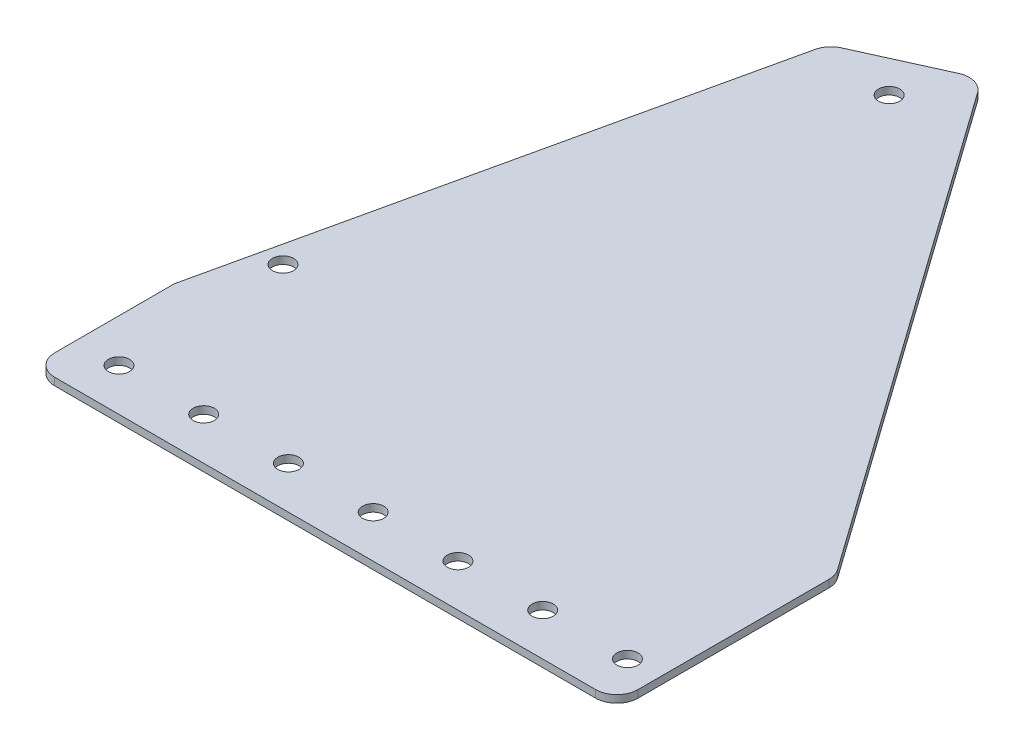
ISO-10303-21;
HEADER;
FILE_DESCRIPTION(('STEP AP214'),'2;1');
FILE_NAME('part.step','',(''),(''),'','','');
FILE_SCHEMA(('AUTOMOTIVE_DESIGN { 1 0 10303 214 1 1 1 1 }'));
ENDSEC;
DATA;
#1=APPLICATION_CONTEXT('core data for automotive mechanical design processes');
#2=APPLICATION_PROTOCOL_DEFINITION('international standard','automotive_design',2000,#1);
#3=PRODUCT_CONTEXT('',#1,'mechanical');
#4=PRODUCT('Part','Part','',(#3));
#5=PRODUCT_RELATED_PRODUCT_CATEGORY('part','',(#4));
#6=PRODUCT_DEFINITION_FORMATION('','',#4);
#7=PRODUCT_DEFINITION_CONTEXT('part definition',#1,'design');
#8=PRODUCT_DEFINITION('design','',#6,#7);
#9=PRODUCT_DEFINITION_SHAPE('','',#8);
#10=(LENGTH_UNIT() NAMED_UNIT(*) SI_UNIT(.MILLI.,.METRE.));
#11=(NAMED_UNIT(*) PLANE_ANGLE_UNIT() SI_UNIT($,.RADIAN.));
#12=(NAMED_UNIT(*) SI_UNIT($,.STERADIAN.) SOLID_ANGLE_UNIT());
#13=UNCERTAINTY_MEASURE_WITH_UNIT(LENGTH_MEASURE(1.E-05),#10,'distance_accuracy_value','');
#14=(GEOMETRIC_REPRESENTATION_CONTEXT(3) GLOBAL_UNCERTAINTY_ASSIGNED_CONTEXT((#13)) GLOBAL_UNIT_ASSIGNED_CONTEXT((#10,
#11,#12)) REPRESENTATION_CONTEXT('',''));
#15=CARTESIAN_POINT('',(0.,0.,0.));
#16=DIRECTION('',(0.,0.,1.));
#17=DIRECTION('',(1.,0.,0.));
#18=AXIS2_PLACEMENT_3D('',#15,#16,#17);
#19=CARTESIAN_POINT('',(19.7313601134908,1.4077243,-14.0112971584868));
#20=DIRECTION('',(0.815343356982086,0.,-0.578977728608953));
#21=DIRECTION('',(-0.578977728608953,0.,-0.815343356982086));
#22=AXIS2_PLACEMENT_3D('',#19,#20,#21);
#23=PLANE('',#22);
#24=DIRECTION('',(0.578977728608953,0.,0.815343356982086));
#25=VECTOR('',#24,1.);
#26=CARTESIAN_POINT('',(19.7313601134908,1.4077243,-14.0112971584868));
#27=LINE('',#26,#25);
#28=CARTESIAN_POINT('',(-59.5688266455337,1.4077243,-125.685507212738));
#29=VERTEX_POINT('',#28);
#30=CARTESIAN_POINT('',(5.26137342792833,1.4077243,-34.3886051907635));
#31=VERTEX_POINT('',#30);
#32=EDGE_CURVE('E317',#29,#31,#27,.T.);
#33=ORIENTED_EDGE('',*,*,#32,.T.);
#34=DIRECTION('',(0.,-1.,0.));
#35=VECTOR('',#34,1.);
#36=CARTESIAN_POINT('',(5.26137342792833,1.4077243,-34.3886051907635));
#37=LINE('',#36,#35);
#38=CARTESIAN_POINT('',(5.26137342792833,0.,-34.3886051907635));
#39=VERTEX_POINT('',#38);
#40=EDGE_CURVE('E250',#31,#39,#37,.T.);
#41=ORIENTED_EDGE('',*,*,#40,.T.);
#42=DIRECTION('',(0.578977728608953,0.,0.815343356982086));
#43=VECTOR('',#42,1.);
#44=CARTESIAN_POINT('',(19.7313601134908,0.,-14.0112971584868));
#45=LINE('',#44,#43);
#46=CARTESIAN_POINT('',(-59.5688266455337,0.,-125.685507212738));
#47=VERTEX_POINT('',#46);
#48=EDGE_CURVE('E194',#47,#39,#45,.T.);
#49=ORIENTED_EDGE('',*,*,#48,.F.);
#50=DIRECTION('',(0.,-1.,0.));
#51=VECTOR('',#50,1.);
#52=CARTESIAN_POINT('',(-59.5688266455337,1.4077243,-125.685507212738));
#53=LINE('',#52,#51);
#54=EDGE_CURVE('E248',#47,#29,#53,.F.);
#55=ORIENTED_EDGE('',*,*,#54,.T.);
#56=EDGE_LOOP('',(#33,#41,#49,#55));
#57=FACE_BOUND('',#56,.T.);
#58=ADVANCED_FACE('F99',(#57),#23,.T.);
#59=CARTESIAN_POINT('',(-58.5914143592902,1.4077243,-129.674191120981));
#60=DIRECTION('',(-0.411755269272863,0.,-0.911294462962456));
#61=DIRECTION('',(-0.911294462962457,0.,0.411755269272864));
#62=AXIS2_PLACEMENT_3D('',#59,#60,#61);
#63=PLANE('',#62);
#64=DIRECTION('',(0.911294462962456,0.,-0.411755269272864));
#65=VECTOR('',#64,1.);
#66=CARTESIAN_POINT('',(-58.5914143592902,0.,-129.674191120981));
#67=LINE('',#66,#65);
#68=CARTESIAN_POINT('',(-79.7053521136975,0.,-120.134162646305));
#69=VERTEX_POINT('',#68);
#70=CARTESIAN_POINT('',(-64.4772211505535,0.,-127.014774150152));
#71=VERTEX_POINT('',#70);
#72=EDGE_CURVE('E267',#69,#71,#67,.T.);
#73=ORIENTED_EDGE('',*,*,#72,.F.);
#74=DIRECTION('',(0.,-1.,0.));
#75=VECTOR('',#74,1.);
#76=CARTESIAN_POINT('',(-79.7053521136975,1.4077243,-120.134162646305));
#77=LINE('',#76,#75);
#78=CARTESIAN_POINT('',(-79.7053521136975,1.4077243,-120.134162646305));
#79=VERTEX_POINT('',#78);
#80=EDGE_CURVE('E12',#69,#79,#77,.F.);
#81=ORIENTED_EDGE('',*,*,#80,.T.);
#82=DIRECTION('',(0.911294462962456,0.,-0.411755269272864));
#83=VECTOR('',#82,1.);
#84=CARTESIAN_POINT('',(-58.5914143592902,1.4077243,-129.674191120981));
#85=LINE('',#84,#83);
#86=CARTESIAN_POINT('',(-64.4772211505535,1.4077243,-127.014774150152));
#87=VERTEX_POINT('',#86);
#88=EDGE_CURVE('E270',#79,#87,#85,.T.);
#89=ORIENTED_EDGE('',*,*,#88,.T.);
#90=DIRECTION('',(0.,-1.,0.));
#91=VECTOR('',#90,1.);
#92=CARTESIAN_POINT('',(-64.4772211505535,1.4077243,-127.014774150152));
#93=LINE('',#92,#91);
#94=EDGE_CURVE('E107',#87,#71,#93,.T.);
#95=ORIENTED_EDGE('',*,*,#94,.T.);
#96=EDGE_LOOP('',(#73,#81,#89,#95));
#97=FACE_BOUND('',#96,.T.);
#98=ADVANCED_FACE('F266',(#97),#63,.T.);
#99=CARTESIAN_POINT('',(-103.106281769292,1.4077243,-23.1374885682187));
#100=DIRECTION('',(0.975734086528721,0.,0.218958882866081));
#101=DIRECTION('',(0.218958882866081,0.,-0.975734086528721));
#102=AXIS2_PLACEMENT_3D('',#99,#100,#101);
#103=PLANE('',#102);
#104=DIRECTION('',(-0.218958882866081,0.,0.975734086528721));
#105=VECTOR('',#104,1.);
#106=CARTESIAN_POINT('',(-103.106281769292,1.4077243,-23.1374885682187));
#107=LINE('',#106,#105);
#108=CARTESIAN_POINT('',(-81.9612673827209,1.4077243,-117.364820325919));
#109=VERTEX_POINT('',#108);
#110=CARTESIAN_POINT('',(-104.029791987605,1.4077243,-19.0221022113343));
#111=VERTEX_POINT('',#110);
#112=EDGE_CURVE('E321',#109,#111,#107,.T.);
#113=ORIENTED_EDGE('',*,*,#112,.F.);
#114=DIRECTION('',(0.,-1.,0.));
#115=VECTOR('',#114,1.);
#116=CARTESIAN_POINT('',(-81.9612673827209,0.,-117.364820325919));
#117=LINE('',#116,#115);
#118=CARTESIAN_POINT('',(-81.9612673827209,0.,-117.364820325919));
#119=VERTEX_POINT('',#118);
#120=EDGE_CURVE('E258',#109,#119,#117,.T.);
#121=ORIENTED_EDGE('',*,*,#120,.T.);
#122=DIRECTION('',(-0.218958882866081,0.,0.975734086528721));
#123=VECTOR('',#122,1.);
#124=CARTESIAN_POINT('',(-103.106281769292,0.,-23.1374885682187));
#125=LINE('',#124,#123);
#126=CARTESIAN_POINT('',(-104.029791987605,0.,-19.0221022113343));
#127=VERTEX_POINT('',#126);
#128=EDGE_CURVE('E274',#119,#127,#125,.T.);
#129=ORIENTED_EDGE('',*,*,#128,.T.);
#130=DIRECTION('',(0.,-1.,0.));
#131=VECTOR('',#130,1.);
#132=CARTESIAN_POINT('',(-104.029791987605,1.4077243,-19.0221022113343));
#133=LINE('',#132,#131);
#134=EDGE_CURVE('E256',#127,#111,#133,.F.);
#135=ORIENTED_EDGE('',*,*,#134,.T.);
#136=EDGE_LOOP('',(#113,#121,#129,#135));
#137=FACE_BOUND('',#136,.T.);
#138=ADVANCED_FACE('F372',(#137),#103,.F.);
#139=CARTESIAN_POINT('',(-104.12685564149,1.4077243,0.));
#140=DIRECTION('',(-1.,0.,0.));
#141=DIRECTION('',(0.,0.,1.));
#142=AXIS2_PLACEMENT_3D('',#139,#140,#141);
#143=PLANE('',#142);
#144=DIRECTION('',(0.,0.,-1.));
#145=VECTOR('',#144,1.);
#146=CARTESIAN_POINT('',(-104.12685564149,0.,0.));
#147=LINE('',#146,#145);
#148=CARTESIAN_POINT('',(-104.12685564149,0.,4.00000000000001));
#149=VERTEX_POINT('',#148);
#150=CARTESIAN_POINT('',(-104.12685564149,0.,-18.1462666798699));
#151=VERTEX_POINT('',#150);
#152=EDGE_CURVE('E277',#149,#151,#147,.T.);
#153=ORIENTED_EDGE('',*,*,#152,.F.);
#154=DIRECTION('',(0.,-1.,0.));
#155=VECTOR('',#154,1.);
#156=CARTESIAN_POINT('',(-104.12685564149,1.4077243,4.00000000000001));
#157=LINE('',#156,#155);
#158=CARTESIAN_POINT('',(-104.12685564149,1.4077243,4.00000000000001));
#159=VERTEX_POINT('',#158);
#160=EDGE_CURVE('E121',#149,#159,#157,.F.);
#161=ORIENTED_EDGE('',*,*,#160,.T.);
#162=DIRECTION('',(0.,0.,-1.));
#163=VECTOR('',#162,1.);
#164=CARTESIAN_POINT('',(-104.12685564149,1.4077243,0.));
#165=LINE('',#164,#163);
#166=CARTESIAN_POINT('',(-104.12685564149,1.4077243,-18.1462666798699));
#167=VERTEX_POINT('',#166);
#168=EDGE_CURVE('E220',#159,#167,#165,.T.);
#169=ORIENTED_EDGE('',*,*,#168,.T.);
#170=DIRECTION('',(0.,-1.,0.));
#171=VECTOR('',#170,1.);
#172=CARTESIAN_POINT('',(-104.12685564149,0.,-18.1462666798699));
#173=LINE('',#172,#171);
#174=EDGE_CURVE('E252',#167,#151,#173,.T.);
#175=ORIENTED_EDGE('',*,*,#174,.T.);
#176=EDGE_LOOP('',(#153,#161,#169,#175));
#177=FACE_BOUND('',#176,.T.);
#178=ADVANCED_FACE('F377',(#177),#143,.T.);
#179=CARTESIAN_POINT('',(0.,1.4077243,8.00000000000001));
#180=DIRECTION('',(0.,0.,-1.));
#181=DIRECTION('',(-1.,0.,0.));
#182=AXIS2_PLACEMENT_3D('',#179,#180,#181);
#183=PLANE('',#182);
#184=DIRECTION('',(1.,0.,0.));
#185=VECTOR('',#184,1.);
#186=CARTESIAN_POINT('',(0.,0.,8.00000000000001));
#187=LINE('',#186,#185);
#188=CARTESIAN_POINT('',(-100.12685564149,0.,8.00000000000001));
#189=VERTEX_POINT('',#188);
#190=CARTESIAN_POINT('',(2.,0.,8.00000000000001));
#191=VERTEX_POINT('',#190);
#192=EDGE_CURVE('E223',#189,#191,#187,.T.);
#193=ORIENTED_EDGE('',*,*,#192,.T.);
#194=DIRECTION('',(0.,-1.,0.));
#195=VECTOR('',#194,1.);
#196=CARTESIAN_POINT('',(2.,1.4077243,8.00000000000001));
#197=LINE('',#196,#195);
#198=CARTESIAN_POINT('',(2.,1.4077243,8.00000000000001));
#199=VERTEX_POINT('',#198);
#200=EDGE_CURVE('E236',#191,#199,#197,.F.);
#201=ORIENTED_EDGE('',*,*,#200,.T.);
#202=DIRECTION('',(1.,0.,0.));
#203=VECTOR('',#202,1.);
#204=CARTESIAN_POINT('',(0.,1.4077243,8.00000000000001));
#205=LINE('',#204,#203);
#206=CARTESIAN_POINT('',(-100.12685564149,1.4077243,8.00000000000001));
#207=VERTEX_POINT('',#206);
#208=EDGE_CURVE('E215',#207,#199,#205,.T.);
#209=ORIENTED_EDGE('',*,*,#208,.F.);
#210=DIRECTION('',(0.,-1.,0.));
#211=VECTOR('',#210,1.);
#212=CARTESIAN_POINT('',(-100.12685564149,0.,8.00000000000001));
#213=LINE('',#212,#211);
#214=EDGE_CURVE('E233',#207,#189,#213,.T.);
#215=ORIENTED_EDGE('',*,*,#214,.T.);
#216=EDGE_LOOP('',(#193,#201,#209,#215));
#217=FACE_BOUND('',#216,.T.);
#218=ADVANCED_FACE('F364',(#217),#183,.F.);
#219=CARTESIAN_POINT('',(6.,1.4077243,0.));
#220=DIRECTION('',(1.,0.,0.));
#221=DIRECTION('',(0.,0.,-1.));
#222=AXIS2_PLACEMENT_3D('',#219,#220,#221);
#223=PLANE('',#222);
#224=DIRECTION('',(0.,0.,1.));
#225=VECTOR('',#224,1.);
#226=CARTESIAN_POINT('',(6.,1.4077243,0.));
#227=LINE('',#226,#225);
#228=CARTESIAN_POINT('',(5.99999999999999,1.4077243,-32.0726942763277));
#229=VERTEX_POINT('',#228);
#230=CARTESIAN_POINT('',(6.,1.4077243,4.00000000000001));
#231=VERTEX_POINT('',#230);
#232=EDGE_CURVE('E315',#229,#231,#227,.T.);
#233=ORIENTED_EDGE('',*,*,#232,.T.);
#234=DIRECTION('',(0.,-1.,0.));
#235=VECTOR('',#234,1.);
#236=CARTESIAN_POINT('',(6.,0.,4.00000000000001));
#237=LINE('',#236,#235);
#238=CARTESIAN_POINT('',(6.,0.,4.00000000000001));
#239=VERTEX_POINT('',#238);
#240=EDGE_CURVE('E209',#231,#239,#237,.T.);
#241=ORIENTED_EDGE('',*,*,#240,.T.);
#242=DIRECTION('',(0.,0.,1.));
#243=VECTOR('',#242,1.);
#244=CARTESIAN_POINT('',(6.,0.,0.));
#245=LINE('',#244,#243);
#246=CARTESIAN_POINT('',(5.99999999999999,0.,-32.0726942763277));
#247=VERTEX_POINT('',#246);
#248=EDGE_CURVE('E192',#247,#239,#245,.T.);
#249=ORIENTED_EDGE('',*,*,#248,.F.);
#250=DIRECTION('',(0.,-1.,0.));
#251=VECTOR('',#250,1.);
#252=CARTESIAN_POINT('',(5.99999999999999,1.4077243,-32.0726942763277));
#253=LINE('',#252,#251);
#254=EDGE_CURVE('E206',#247,#229,#253,.F.);
#255=ORIENTED_EDGE('',*,*,#254,.T.);
#256=EDGE_LOOP('',(#233,#241,#249,#255));
#257=FACE_BOUND('',#256,.T.);
#258=ADVANCED_FACE('F205',(#257),#223,.T.);
#259=CARTESIAN_POINT('',(-16.,1.4077243,0.));
#260=DIRECTION('',(0.,-1.,0.));
#261=DIRECTION('',(0.,0.,-1.));
#262=AXIS2_PLACEMENT_3D('',#259,#260,#261);
#263=CYLINDRICAL_SURFACE('',#262,2.);
#264=CARTESIAN_POINT('',(-16.,1.4077243,0.));
#265=DIRECTION('',(0.,1.,0.));
#266=DIRECTION('',(0.,0.,1.));
#267=AXIS2_PLACEMENT_3D('',#264,#265,#266);
#268=CIRCLE('',#267,2.);
#269=CARTESIAN_POINT('',(-16.,1.4077243,2.));
#270=VERTEX_POINT('',#269);
#271=EDGE_CURVE('E312',#270,#270,#268,.T.);
#272=ORIENTED_EDGE('',*,*,#271,.T.);
#273=EDGE_LOOP('',(#272));
#274=FACE_BOUND('',#273,.T.);
#275=CARTESIAN_POINT('',(-16.,0.,0.));
#276=DIRECTION('',(0.,1.,0.));
#277=DIRECTION('',(0.,0.,1.));
#278=AXIS2_PLACEMENT_3D('',#275,#276,#277);
#279=CIRCLE('',#278,2.);
#280=CARTESIAN_POINT('',(-16.,0.,2.));
#281=VERTEX_POINT('',#280);
#282=EDGE_CURVE('E210',#281,#281,#279,.T.);
#283=ORIENTED_EDGE('',*,*,#282,.F.);
#284=EDGE_LOOP('',(#283));
#285=FACE_BOUND('',#284,.T.);
#286=ADVANCED_FACE('F352',(#274,#285),#263,.F.);
#287=CARTESIAN_POINT('',(0.,1.4077243,0.));
#288=DIRECTION('',(0.,-1.,0.));
#289=DIRECTION('',(0.,0.,-1.));
#290=AXIS2_PLACEMENT_3D('',#287,#288,#289);
#291=CYLINDRICAL_SURFACE('',#290,2.);
#292=CARTESIAN_POINT('',(0.,1.4077243,0.));
#293=DIRECTION('',(0.,1.,0.));
#294=DIRECTION('',(0.,0.,1.));
#295=AXIS2_PLACEMENT_3D('',#292,#293,#294);
#296=CIRCLE('',#295,2.);
#297=CARTESIAN_POINT('',(0.,1.4077243,2.));
#298=VERTEX_POINT('',#297);
#299=EDGE_CURVE('E309',#298,#298,#296,.T.);
#300=ORIENTED_EDGE('',*,*,#299,.T.);
#301=EDGE_LOOP('',(#300));
#302=FACE_BOUND('',#301,.T.);
#303=CARTESIAN_POINT('',(0.,0.,0.));
#304=DIRECTION('',(0.,1.,0.));
#305=DIRECTION('',(0.,0.,1.));
#306=AXIS2_PLACEMENT_3D('',#303,#304,#305);
#307=CIRCLE('',#306,2.);
#308=CARTESIAN_POINT('',(0.,0.,2.));
#309=VERTEX_POINT('',#308);
#310=EDGE_CURVE('E345',#309,#309,#307,.T.);
#311=ORIENTED_EDGE('',*,*,#310,.F.);
#312=EDGE_LOOP('',(#311));
#313=FACE_BOUND('',#312,.T.);
#314=ADVANCED_FACE('F354',(#302,#313),#291,.F.);
#315=CARTESIAN_POINT('',(-67.4999999999998,1.4077243,-116.913429510899));
#316=DIRECTION('',(0.,-1.,0.));
#317=DIRECTION('',(0.,0.,-1.));
#318=AXIS2_PLACEMENT_3D('',#315,#316,#317);
#319=CYLINDRICAL_SURFACE('',#318,2.00000000000001);
#320=CARTESIAN_POINT('',(-67.4999999999998,1.4077243,-116.913429510899));
#321=DIRECTION('',(0.,1.,0.));
#322=DIRECTION('',(0.,0.,1.));
#323=AXIS2_PLACEMENT_3D('',#320,#321,#322);
#324=CIRCLE('',#323,2.00000000000001);
#325=CARTESIAN_POINT('',(-67.4999999999998,1.4077243,-114.913429510899));
#326=VERTEX_POINT('',#325);
#327=EDGE_CURVE('E306',#326,#326,#324,.T.);
#328=ORIENTED_EDGE('',*,*,#327,.T.);
#329=EDGE_LOOP('',(#328));
#330=FACE_BOUND('',#329,.T.);
#331=CARTESIAN_POINT('',(-67.4999999999998,0.,-116.913429510899));
#332=DIRECTION('',(0.,1.,0.));
#333=DIRECTION('',(0.,0.,1.));
#334=AXIS2_PLACEMENT_3D('',#331,#332,#333);
#335=CIRCLE('',#334,2.00000000000001);
#336=CARTESIAN_POINT('',(-67.4999999999998,0.,-114.913429510899));
#337=VERTEX_POINT('',#336);
#338=EDGE_CURVE('E342',#337,#337,#335,.T.);
#339=ORIENTED_EDGE('',*,*,#338,.F.);
#340=EDGE_LOOP('',(#339));
#341=FACE_BOUND('',#340,.T.);
#342=ADVANCED_FACE('F361',(#330,#341),#319,.F.);
#343=CARTESIAN_POINT('',(-32.,1.4077243,1.1172740284298E-13));
#344=DIRECTION('',(0.,-1.,0.));
#345=DIRECTION('',(0.,0.,-1.));
#346=AXIS2_PLACEMENT_3D('',#343,#344,#345);
#347=CYLINDRICAL_SURFACE('',#346,2.);
#348=CARTESIAN_POINT('',(-32.,1.4077243,1.1172740284298E-13));
#349=DIRECTION('',(0.,1.,0.));
#350=DIRECTION('',(0.,0.,1.));
#351=AXIS2_PLACEMENT_3D('',#348,#349,#350);
#352=CIRCLE('',#351,2.);
#353=CARTESIAN_POINT('',(-32.,1.4077243,2.00000000000011));
#354=VERTEX_POINT('',#353);
#355=EDGE_CURVE('E303',#354,#354,#352,.T.);
#356=ORIENTED_EDGE('',*,*,#355,.T.);
#357=EDGE_LOOP('',(#356));
#358=FACE_BOUND('',#357,.T.);
#359=CARTESIAN_POINT('',(-32.,0.,1.1172740284298E-13));
#360=DIRECTION('',(0.,1.,0.));
#361=DIRECTION('',(0.,0.,1.));
#362=AXIS2_PLACEMENT_3D('',#359,#360,#361);
#363=CIRCLE('',#362,2.);
#364=CARTESIAN_POINT('',(-32.,0.,2.00000000000011));
#365=VERTEX_POINT('',#364);
#366=EDGE_CURVE('E339',#365,#365,#363,.T.);
#367=ORIENTED_EDGE('',*,*,#366,.F.);
#368=EDGE_LOOP('',(#367));
#369=FACE_BOUND('',#368,.T.);
#370=ADVANCED_FACE('F564',(#358,#369),#347,.F.);
#371=CARTESIAN_POINT('',(-47.9999999999999,1.4077243,2.2345480568596E-13));
#372=DIRECTION('',(0.,-1.,0.));
#373=DIRECTION('',(0.,0.,-1.));
#374=AXIS2_PLACEMENT_3D('',#371,#372,#373);
#375=CYLINDRICAL_SURFACE('',#374,2.);
#376=CARTESIAN_POINT('',(-47.9999999999999,1.4077243,2.2345480568596E-13));
#377=DIRECTION('',(0.,1.,0.));
#378=DIRECTION('',(0.,0.,1.));
#379=AXIS2_PLACEMENT_3D('',#376,#377,#378);
#380=CIRCLE('',#379,2.);
#381=CARTESIAN_POINT('',(-47.9999999999999,1.4077243,2.00000000000022));
#382=VERTEX_POINT('',#381);
#383=EDGE_CURVE('E300',#382,#382,#380,.T.);
#384=ORIENTED_EDGE('',*,*,#383,.T.);
#385=EDGE_LOOP('',(#384));
#386=FACE_BOUND('',#385,.T.);
#387=CARTESIAN_POINT('',(-47.9999999999999,0.,2.2345480568596E-13));
#388=DIRECTION('',(0.,1.,0.));
#389=DIRECTION('',(0.,0.,1.));
#390=AXIS2_PLACEMENT_3D('',#387,#388,#389);
#391=CIRCLE('',#390,2.);
#392=CARTESIAN_POINT('',(-47.9999999999999,0.,2.00000000000022));
#393=VERTEX_POINT('',#392);
#394=EDGE_CURVE('E336',#393,#393,#391,.T.);
#395=ORIENTED_EDGE('',*,*,#394,.F.);
#396=EDGE_LOOP('',(#395));
#397=FACE_BOUND('',#396,.T.);
#398=ADVANCED_FACE('F554',(#386,#397),#375,.F.);
#399=CARTESIAN_POINT('',(-63.9999999999999,1.4077243,3.3518220852894E-13));
#400=DIRECTION('',(0.,-1.,0.));
#401=DIRECTION('',(0.,0.,-1.));
#402=AXIS2_PLACEMENT_3D('',#399,#400,#401);
#403=CYLINDRICAL_SURFACE('',#402,2.);
#404=CARTESIAN_POINT('',(-63.9999999999999,1.4077243,3.3518220852894E-13));
#405=DIRECTION('',(0.,1.,0.));
#406=DIRECTION('',(0.,0.,1.));
#407=AXIS2_PLACEMENT_3D('',#404,#405,#406);
#408=CIRCLE('',#407,2.);
#409=CARTESIAN_POINT('',(-63.9999999999999,1.4077243,2.00000000000033));
#410=VERTEX_POINT('',#409);
#411=EDGE_CURVE('E297',#410,#410,#408,.T.);
#412=ORIENTED_EDGE('',*,*,#411,.T.);
#413=EDGE_LOOP('',(#412));
#414=FACE_BOUND('',#413,.T.);
#415=CARTESIAN_POINT('',(-63.9999999999999,0.,3.3518220852894E-13));
#416=DIRECTION('',(0.,1.,0.));
#417=DIRECTION('',(0.,0.,1.));
#418=AXIS2_PLACEMENT_3D('',#415,#416,#417);
#419=CIRCLE('',#418,2.);
#420=CARTESIAN_POINT('',(-63.9999999999999,0.,2.00000000000033));
#421=VERTEX_POINT('',#420);
#422=EDGE_CURVE('E333',#421,#421,#419,.T.);
#423=ORIENTED_EDGE('',*,*,#422,.F.);
#424=EDGE_LOOP('',(#423));
#425=FACE_BOUND('',#424,.T.);
#426=ADVANCED_FACE('F544',(#414,#425),#403,.F.);
#427=CARTESIAN_POINT('',(-79.9999999999999,1.4077243,4.4690961137192E-13));
#428=DIRECTION('',(0.,-1.,0.));
#429=DIRECTION('',(0.,0.,-1.));
#430=AXIS2_PLACEMENT_3D('',#427,#428,#429);
#431=CYLINDRICAL_SURFACE('',#430,2.);
#432=CARTESIAN_POINT('',(-79.9999999999999,1.4077243,4.4690961137192E-13));
#433=DIRECTION('',(0.,1.,0.));
#434=DIRECTION('',(0.,0.,1.));
#435=AXIS2_PLACEMENT_3D('',#432,#433,#434);
#436=CIRCLE('',#435,2.);
#437=CARTESIAN_POINT('',(-79.9999999999999,1.4077243,2.00000000000044));
#438=VERTEX_POINT('',#437);
#439=EDGE_CURVE('E292',#438,#438,#436,.T.);
#440=ORIENTED_EDGE('',*,*,#439,.T.);
#441=EDGE_LOOP('',(#440));
#442=FACE_BOUND('',#441,.T.);
#443=CARTESIAN_POINT('',(-79.9999999999999,0.,4.4690961137192E-13));
#444=DIRECTION('',(0.,1.,0.));
#445=DIRECTION('',(0.,0.,1.));
#446=AXIS2_PLACEMENT_3D('',#443,#444,#445);
#447=CIRCLE('',#446,2.);
#448=CARTESIAN_POINT('',(-79.9999999999999,0.,2.00000000000044));
#449=VERTEX_POINT('',#448);
#450=EDGE_CURVE('E330',#449,#449,#447,.T.);
#451=ORIENTED_EDGE('',*,*,#450,.F.);
#452=EDGE_LOOP('',(#451));
#453=FACE_BOUND('',#452,.T.);
#454=ADVANCED_FACE('F534',(#442,#453),#431,.F.);
#455=CARTESIAN_POINT('',(-96.,1.4077243,5.58637014214901E-13));
#456=DIRECTION('',(0.,-1.,0.));
#457=DIRECTION('',(0.,0.,-1.));
#458=AXIS2_PLACEMENT_3D('',#455,#456,#457);
#459=CYLINDRICAL_SURFACE('',#458,2.);
#460=CARTESIAN_POINT('',(-96.,1.4077243,5.58637014214901E-13));
#461=DIRECTION('',(0.,1.,0.));
#462=DIRECTION('',(0.,0.,1.));
#463=AXIS2_PLACEMENT_3D('',#460,#461,#462);
#464=CIRCLE('',#463,2.);
#465=CARTESIAN_POINT('',(-96.,1.4077243,2.00000000000055));
#466=VERTEX_POINT('',#465);
#467=EDGE_CURVE('E287',#466,#466,#464,.T.);
#468=ORIENTED_EDGE('',*,*,#467,.T.);
#469=EDGE_LOOP('',(#468));
#470=FACE_BOUND('',#469,.T.);
#471=CARTESIAN_POINT('',(-96.,0.,5.58637014214901E-13));
#472=DIRECTION('',(0.,1.,0.));
#473=DIRECTION('',(0.,0.,1.));
#474=AXIS2_PLACEMENT_3D('',#471,#472,#473);
#475=CIRCLE('',#474,2.);
#476=CARTESIAN_POINT('',(-96.,0.,2.00000000000055));
#477=VERTEX_POINT('',#476);
#478=EDGE_CURVE('E327',#477,#477,#475,.T.);
#479=ORIENTED_EDGE('',*,*,#478,.F.);
#480=EDGE_LOOP('',(#479));
#481=FACE_BOUND('',#480,.T.);
#482=ADVANCED_FACE('F525',(#470,#481),#459,.F.);
#483=CARTESIAN_POINT('',(-97.0216798374737,1.4077243,-31.9836860025492));
#484=DIRECTION('',(0.,-1.,0.));
#485=DIRECTION('',(0.,0.,-1.));
#486=AXIS2_PLACEMENT_3D('',#483,#484,#485);
#487=CYLINDRICAL_SURFACE('',#486,2.);
#488=CARTESIAN_POINT('',(-97.0216798374737,1.4077243,-31.9836860025492));
#489=DIRECTION('',(0.,1.,0.));
#490=DIRECTION('',(0.,0.,1.));
#491=AXIS2_PLACEMENT_3D('',#488,#489,#490);
#492=CIRCLE('',#491,2.);
#493=CARTESIAN_POINT('',(-97.0216798374737,1.4077243,-29.9836860025492));
#494=VERTEX_POINT('',#493);
#495=EDGE_CURVE('E282',#494,#494,#492,.T.);
#496=ORIENTED_EDGE('',*,*,#495,.T.);
#497=EDGE_LOOP('',(#496));
#498=FACE_BOUND('',#497,.T.);
#499=CARTESIAN_POINT('',(-97.0216798374737,0.,-31.9836860025492));
#500=DIRECTION('',(0.,1.,0.));
#501=DIRECTION('',(0.,0.,1.));
#502=AXIS2_PLACEMENT_3D('',#499,#500,#501);
#503=CIRCLE('',#502,2.);
#504=CARTESIAN_POINT('',(-97.0216798374737,0.,-29.9836860025492));
#505=VERTEX_POINT('',#504);
#506=EDGE_CURVE('E324',#505,#505,#503,.T.);
#507=ORIENTED_EDGE('',*,*,#506,.F.);
#508=EDGE_LOOP('',(#507));
#509=FACE_BOUND('',#508,.T.);
#510=ADVANCED_FACE('F386',(#498,#509),#487,.F.);
#511=CARTESIAN_POINT('',(0.,0.,0.));
#512=DIRECTION('',(0.,1.,0.));
#513=DIRECTION('',(0.,0.,1.));
#514=AXIS2_PLACEMENT_3D('',#511,#512,#513);
#515=PLANE('',#514);
#516=ORIENTED_EDGE('',*,*,#506,.T.);
#517=EDGE_LOOP('',(#516));
#518=FACE_BOUND('',#517,.T.);
#519=ORIENTED_EDGE('',*,*,#478,.T.);
#520=EDGE_LOOP('',(#519));
#521=FACE_BOUND('',#520,.T.);
#522=ORIENTED_EDGE('',*,*,#450,.T.);
#523=EDGE_LOOP('',(#522));
#524=FACE_BOUND('',#523,.T.);
#525=ORIENTED_EDGE('',*,*,#422,.T.);
#526=EDGE_LOOP('',(#525));
#527=FACE_BOUND('',#526,.T.);
#528=ORIENTED_EDGE('',*,*,#394,.T.);
#529=EDGE_LOOP('',(#528));
#530=FACE_BOUND('',#529,.T.);
#531=ORIENTED_EDGE('',*,*,#366,.T.);
#532=EDGE_LOOP('',(#531));
#533=FACE_BOUND('',#532,.T.);
#534=ORIENTED_EDGE('',*,*,#338,.T.);
#535=EDGE_LOOP('',(#534));
#536=FACE_BOUND('',#535,.T.);
#537=ORIENTED_EDGE('',*,*,#310,.T.);
#538=EDGE_LOOP('',(#537));
#539=FACE_BOUND('',#538,.T.);
#540=ORIENTED_EDGE('',*,*,#282,.T.);
#541=EDGE_LOOP('',(#540));
#542=FACE_BOUND('',#541,.T.);
#543=ORIENTED_EDGE('',*,*,#248,.T.);
#544=CARTESIAN_POINT('',(2.,0.,4.00000000000001));
#545=DIRECTION('',(0.,1.,0.));
#546=DIRECTION('',(0.,0.,1.));
#547=AXIS2_PLACEMENT_3D('',#544,#545,#546);
#548=CIRCLE('',#547,4.);
#549=EDGE_CURVE('E199',#239,#191,#548,.F.);
#550=ORIENTED_EDGE('',*,*,#549,.T.);
#551=ORIENTED_EDGE('',*,*,#192,.F.);
#552=CARTESIAN_POINT('',(-100.12685564149,0.,4.00000000000001));
#553=DIRECTION('',(0.,1.,0.));
#554=DIRECTION('',(0.,0.,1.));
#555=AXIS2_PLACEMENT_3D('',#552,#553,#554);
#556=CIRCLE('',#555,4.);
#557=EDGE_CURVE('E200',#189,#149,#556,.F.);
#558=ORIENTED_EDGE('',*,*,#557,.T.);
#559=ORIENTED_EDGE('',*,*,#152,.T.);
#560=CARTESIAN_POINT('',(-100.12685564149,0.,-18.1462666798699));
#561=DIRECTION('',(0.,1.,0.));
#562=DIRECTION('',(0.,0.,1.));
#563=AXIS2_PLACEMENT_3D('',#560,#561,#562);
#564=CIRCLE('',#563,4.);
#565=EDGE_CURVE('E217',#151,#127,#564,.F.);
#566=ORIENTED_EDGE('',*,*,#565,.T.);
#567=ORIENTED_EDGE('',*,*,#128,.F.);
#568=CARTESIAN_POINT('',(-78.058331036606,0.,-116.488984794455));
#569=DIRECTION('',(0.,1.,0.));
#570=DIRECTION('',(0.,0.,1.));
#571=AXIS2_PLACEMENT_3D('',#568,#569,#570);
#572=CIRCLE('',#571,4.);
#573=EDGE_CURVE('E229',#119,#69,#572,.F.);
#574=ORIENTED_EDGE('',*,*,#573,.T.);
#575=ORIENTED_EDGE('',*,*,#72,.T.);
#576=CARTESIAN_POINT('',(-62.8302000734621,0.,-123.369596298302));
#577=DIRECTION('',(0.,1.,0.));
#578=DIRECTION('',(0.,0.,1.));
#579=AXIS2_PLACEMENT_3D('',#576,#577,#578);
#580=CIRCLE('',#579,4.);
#581=EDGE_CURVE('E227',#71,#47,#580,.F.);
#582=ORIENTED_EDGE('',*,*,#581,.T.);
#583=ORIENTED_EDGE('',*,*,#48,.T.);
#584=CARTESIAN_POINT('',(1.99999999999999,0.,-32.0726942763277));
#585=DIRECTION('',(0.,1.,0.));
#586=DIRECTION('',(0.,0.,1.));
#587=AXIS2_PLACEMENT_3D('',#584,#585,#586);
#588=CIRCLE('',#587,4.);
#589=EDGE_CURVE('E189',#39,#247,#588,.F.);
#590=ORIENTED_EDGE('',*,*,#589,.T.);
#591=EDGE_LOOP('',(#543,#550,#551,#558,#559,#566,#567,#574,#575,#582,#583,#590));
#592=FACE_BOUND('',#591,.T.);
#593=ADVANCED_FACE('F191',(#518,#521,#524,#527,#530,#533,#536,#539,#542,#592),#515,.F.);
#594=CARTESIAN_POINT('',(0.,1.4077243,0.));
#595=DIRECTION('',(0.,1.,0.));
#596=DIRECTION('',(0.,0.,1.));
#597=AXIS2_PLACEMENT_3D('',#594,#595,#596);
#598=PLANE('',#597);
#599=ORIENTED_EDGE('',*,*,#495,.F.);
#600=EDGE_LOOP('',(#599));
#601=FACE_BOUND('',#600,.T.);
#602=ORIENTED_EDGE('',*,*,#467,.F.);
#603=EDGE_LOOP('',(#602));
#604=FACE_BOUND('',#603,.T.);
#605=ORIENTED_EDGE('',*,*,#439,.F.);
#606=EDGE_LOOP('',(#605));
#607=FACE_BOUND('',#606,.T.);
#608=ORIENTED_EDGE('',*,*,#411,.F.);
#609=EDGE_LOOP('',(#608));
#610=FACE_BOUND('',#609,.T.);
#611=ORIENTED_EDGE('',*,*,#383,.F.);
#612=EDGE_LOOP('',(#611));
#613=FACE_BOUND('',#612,.T.);
#614=ORIENTED_EDGE('',*,*,#355,.F.);
#615=EDGE_LOOP('',(#614));
#616=FACE_BOUND('',#615,.T.);
#617=ORIENTED_EDGE('',*,*,#327,.F.);
#618=EDGE_LOOP('',(#617));
#619=FACE_BOUND('',#618,.T.);
#620=ORIENTED_EDGE('',*,*,#299,.F.);
#621=EDGE_LOOP('',(#620));
#622=FACE_BOUND('',#621,.T.);
#623=ORIENTED_EDGE('',*,*,#271,.F.);
#624=EDGE_LOOP('',(#623));
#625=FACE_BOUND('',#624,.T.);
#626=ORIENTED_EDGE('',*,*,#208,.T.);
#627=CARTESIAN_POINT('',(2.,1.4077243,4.00000000000001));
#628=DIRECTION('',(0.,1.,0.));
#629=DIRECTION('',(0.,0.,1.));
#630=AXIS2_PLACEMENT_3D('',#627,#628,#629);
#631=CIRCLE('',#630,4.);
#632=EDGE_CURVE('E246',#199,#231,#631,.T.);
#633=ORIENTED_EDGE('',*,*,#632,.T.);
#634=ORIENTED_EDGE('',*,*,#232,.F.);
#635=CARTESIAN_POINT('',(1.99999999999999,1.4077243,-32.0726942763277));
#636=DIRECTION('',(0.,1.,0.));
#637=DIRECTION('',(0.,0.,1.));
#638=AXIS2_PLACEMENT_3D('',#635,#636,#637);
#639=CIRCLE('',#638,4.);
#640=EDGE_CURVE('E214',#229,#31,#639,.T.);
#641=ORIENTED_EDGE('',*,*,#640,.T.);
#642=ORIENTED_EDGE('',*,*,#32,.F.);
#643=CARTESIAN_POINT('',(-62.8302000734621,1.4077243,-123.369596298302));
#644=DIRECTION('',(0.,1.,0.));
#645=DIRECTION('',(0.,0.,1.));
#646=AXIS2_PLACEMENT_3D('',#643,#644,#645);
#647=CIRCLE('',#646,4.);
#648=EDGE_CURVE('E239',#29,#87,#647,.T.);
#649=ORIENTED_EDGE('',*,*,#648,.T.);
#650=ORIENTED_EDGE('',*,*,#88,.F.);
#651=CARTESIAN_POINT('',(-78.058331036606,1.4077243,-116.488984794455));
#652=DIRECTION('',(0.,1.,0.));
#653=DIRECTION('',(0.,0.,1.));
#654=AXIS2_PLACEMENT_3D('',#651,#652,#653);
#655=CIRCLE('',#654,4.);
#656=EDGE_CURVE('E241',#79,#109,#655,.T.);
#657=ORIENTED_EDGE('',*,*,#656,.T.);
#658=ORIENTED_EDGE('',*,*,#112,.T.);
#659=CARTESIAN_POINT('',(-100.12685564149,1.4077243,-18.1462666798699));
#660=DIRECTION('',(0.,1.,0.));
#661=DIRECTION('',(0.,0.,1.));
#662=AXIS2_PLACEMENT_3D('',#659,#660,#661);
#663=CIRCLE('',#662,4.);
#664=EDGE_CURVE('E114',#111,#167,#663,.T.);
#665=ORIENTED_EDGE('',*,*,#664,.T.);
#666=ORIENTED_EDGE('',*,*,#168,.F.);
#667=CARTESIAN_POINT('',(-100.12685564149,1.4077243,4.00000000000001));
#668=DIRECTION('',(0.,1.,0.));
#669=DIRECTION('',(0.,0.,1.));
#670=AXIS2_PLACEMENT_3D('',#667,#668,#669);
#671=CIRCLE('',#670,4.);
#672=EDGE_CURVE('E243',#159,#207,#671,.T.);
#673=ORIENTED_EDGE('',*,*,#672,.T.);
#674=EDGE_LOOP('',(#626,#633,#634,#641,#642,#649,#650,#657,#658,#665,#666,#673));
#675=FACE_BOUND('',#674,.T.);
#676=ADVANCED_FACE('F385',(#601,#604,#607,#610,#613,#616,#619,#622,#625,#675),#598,.T.);
#677=CARTESIAN_POINT('',(2.,1.4077243,4.00000000000001));
#678=DIRECTION('',(0.,1.,0.));
#679=DIRECTION('',(0.,0.,1.));
#680=AXIS2_PLACEMENT_3D('',#677,#678,#679);
#681=CYLINDRICAL_SURFACE('',#680,4.);
#682=ORIENTED_EDGE('',*,*,#632,.F.);
#683=ORIENTED_EDGE('',*,*,#200,.F.);
#684=ORIENTED_EDGE('',*,*,#549,.F.);
#685=ORIENTED_EDGE('',*,*,#240,.F.);
#686=EDGE_LOOP('',(#682,#683,#684,#685));
#687=FACE_BOUND('',#686,.T.);
#688=ADVANCED_FACE('F389',(#687),#681,.T.);
#689=CARTESIAN_POINT('',(1.99999999999999,1.4077243,-32.0726942763277));
#690=DIRECTION('',(0.,-1.,0.));
#691=DIRECTION('',(0.,0.,-1.));
#692=AXIS2_PLACEMENT_3D('',#689,#690,#691);
#693=CYLINDRICAL_SURFACE('',#692,4.);
#694=ORIENTED_EDGE('',*,*,#640,.F.);
#695=ORIENTED_EDGE('',*,*,#254,.F.);
#696=ORIENTED_EDGE('',*,*,#589,.F.);
#697=ORIENTED_EDGE('',*,*,#40,.F.);
#698=EDGE_LOOP('',(#694,#695,#696,#697));
#699=FACE_BOUND('',#698,.T.);
#700=ADVANCED_FACE('F213',(#699),#693,.T.);
#701=CARTESIAN_POINT('',(-100.12685564149,1.4077243,4.00000000000001));
#702=DIRECTION('',(0.,1.,0.));
#703=DIRECTION('',(0.,0.,1.));
#704=AXIS2_PLACEMENT_3D('',#701,#702,#703);
#705=CYLINDRICAL_SURFACE('',#704,4.);
#706=ORIENTED_EDGE('',*,*,#672,.F.);
#707=ORIENTED_EDGE('',*,*,#160,.F.);
#708=ORIENTED_EDGE('',*,*,#557,.F.);
#709=ORIENTED_EDGE('',*,*,#214,.F.);
#710=EDGE_LOOP('',(#706,#707,#708,#709));
#711=FACE_BOUND('',#710,.T.);
#712=ADVANCED_FACE('F418',(#711),#705,.T.);
#713=CARTESIAN_POINT('',(-78.058331036606,1.4077243,-116.488984794455));
#714=DIRECTION('',(0.,1.,0.));
#715=DIRECTION('',(0.,0.,1.));
#716=AXIS2_PLACEMENT_3D('',#713,#714,#715);
#717=CYLINDRICAL_SURFACE('',#716,4.);
#718=ORIENTED_EDGE('',*,*,#656,.F.);
#719=ORIENTED_EDGE('',*,*,#80,.F.);
#720=ORIENTED_EDGE('',*,*,#573,.F.);
#721=ORIENTED_EDGE('',*,*,#120,.F.);
#722=EDGE_LOOP('',(#718,#719,#720,#721));
#723=FACE_BOUND('',#722,.T.);
#724=ADVANCED_FACE('F420',(#723),#717,.T.);
#725=CARTESIAN_POINT('',(-62.8302000734621,1.4077243,-123.369596298302));
#726=DIRECTION('',(0.,-1.,0.));
#727=DIRECTION('',(0.,0.,-1.));
#728=AXIS2_PLACEMENT_3D('',#725,#726,#727);
#729=CYLINDRICAL_SURFACE('',#728,4.);
#730=ORIENTED_EDGE('',*,*,#648,.F.);
#731=ORIENTED_EDGE('',*,*,#54,.F.);
#732=ORIENTED_EDGE('',*,*,#581,.F.);
#733=ORIENTED_EDGE('',*,*,#94,.F.);
#734=EDGE_LOOP('',(#730,#731,#732,#733));
#735=FACE_BOUND('',#734,.T.);
#736=ADVANCED_FACE('F426',(#735),#729,.T.);
#737=CARTESIAN_POINT('',(-100.12685564149,1.4077243,-18.1462666798699));
#738=DIRECTION('',(0.,1.,0.));
#739=DIRECTION('',(0.,0.,1.));
#740=AXIS2_PLACEMENT_3D('',#737,#738,#739);
#741=CYLINDRICAL_SURFACE('',#740,4.);
#742=ORIENTED_EDGE('',*,*,#664,.F.);
#743=ORIENTED_EDGE('',*,*,#134,.F.);
#744=ORIENTED_EDGE('',*,*,#565,.F.);
#745=ORIENTED_EDGE('',*,*,#174,.F.);
#746=EDGE_LOOP('',(#742,#743,#744,#745));
#747=FACE_BOUND('',#746,.T.);
#748=ADVANCED_FACE('F101',(#747),#741,.T.);
#749=CLOSED_SHELL('',(#58,#98,#138,#178,#218,#258,#286,#314,#342,#370,#398,#426,#454,#482,#510,
#593,#676,#688,#700,#712,#724,#736,#748));
#750=MANIFOLD_SOLID_BREP('B2',#749);
#751=ADVANCED_BREP_SHAPE_REPRESENTATION('',(#18,#750),#14);
#752=SHAPE_DEFINITION_REPRESENTATION(#9,#751);
ENDSEC;
END-ISO-10303-21;
